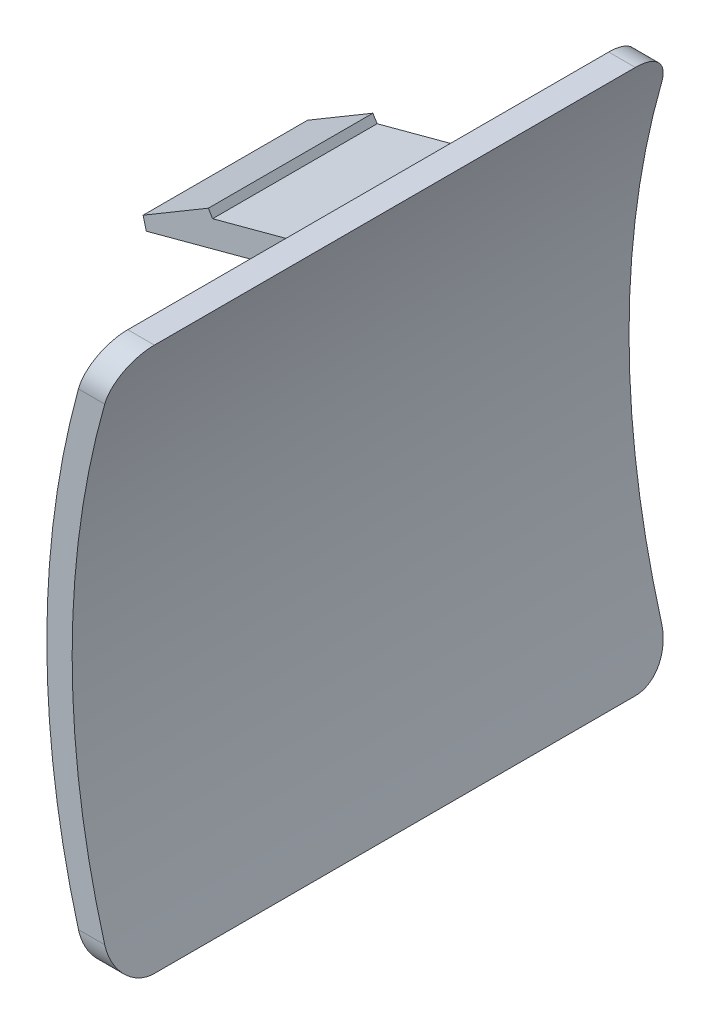
ISO-10303-21;
HEADER;
FILE_DESCRIPTION(('STEP AP214'),'2;1');
FILE_NAME('part.step','',(''),(''),'','','');
FILE_SCHEMA(('AUTOMOTIVE_DESIGN { 1 0 10303 214 1 1 1 1 }'));
ENDSEC;
DATA;
#1=APPLICATION_CONTEXT('core data for automotive mechanical design processes');
#2=APPLICATION_PROTOCOL_DEFINITION('international standard','automotive_design',2000,#1);
#3=PRODUCT_CONTEXT('',#1,'mechanical');
#4=PRODUCT('Part','Part','',(#3));
#5=PRODUCT_RELATED_PRODUCT_CATEGORY('part','',(#4));
#6=PRODUCT_DEFINITION_FORMATION('','',#4);
#7=PRODUCT_DEFINITION_CONTEXT('part definition',#1,'design');
#8=PRODUCT_DEFINITION('design','',#6,#7);
#9=PRODUCT_DEFINITION_SHAPE('','',#8);
#10=(LENGTH_UNIT() NAMED_UNIT(*) SI_UNIT(.MILLI.,.METRE.));
#11=(NAMED_UNIT(*) PLANE_ANGLE_UNIT() SI_UNIT($,.RADIAN.));
#12=(NAMED_UNIT(*) SI_UNIT($,.STERADIAN.) SOLID_ANGLE_UNIT());
#13=UNCERTAINTY_MEASURE_WITH_UNIT(LENGTH_MEASURE(1.E-05),#10,'distance_accuracy_value','');
#14=(GEOMETRIC_REPRESENTATION_CONTEXT(3) GLOBAL_UNCERTAINTY_ASSIGNED_CONTEXT((#13)) GLOBAL_UNIT_ASSIGNED_CONTEXT((#10,
#11,#12)) REPRESENTATION_CONTEXT('',''));
#15=CARTESIAN_POINT('',(0.,0.,0.));
#16=DIRECTION('',(0.,0.,1.));
#17=DIRECTION('',(1.,0.,0.));
#18=AXIS2_PLACEMENT_3D('',#15,#16,#17);
#19=CARTESIAN_POINT('',(64.2857142857143,21.5,22.));
#20=DIRECTION('',(0.,0.,-1.));
#21=DIRECTION('',(-1.,0.,0.));
#22=AXIS2_PLACEMENT_3D('',#19,#20,#21);
#23=CYLINDRICAL_SURFACE('',#22,69.7857142857143);
#24=DIRECTION('',(0.,0.,-1.));
#25=VECTOR('',#24,1.);
#26=CARTESIAN_POINT('',(-2.10551946067234,0.,22.));
#27=LINE('',#26,#25);
#28=CARTESIAN_POINT('',(-2.10551946067234,0.,-14.));
#29=VERTEX_POINT('',#28);
#30=CARTESIAN_POINT('',(-2.10551946067234,0.,-19.));
#31=VERTEX_POINT('',#30);
#32=EDGE_CURVE('E259',#29,#31,#27,.T.);
#33=ORIENTED_EDGE('',*,*,#32,.F.);
#34=CARTESIAN_POINT('',(64.2857142857143,21.5,-14.));
#35=DIRECTION('',(0.,0.,-1.));
#36=DIRECTION('',(-1.,0.,0.));
#37=AXIS2_PLACEMENT_3D('',#34,#35,#36);
#38=CIRCLE('',#37,69.7857142857143);
#39=CARTESIAN_POINT('',(-2.72022514033471,2.,-14.));
#40=VERTEX_POINT('',#39);
#41=EDGE_CURVE('E11',#29,#40,#38,.T.);
#42=ORIENTED_EDGE('',*,*,#41,.T.);
#43=DIRECTION('',(0.,0.,1.));
#44=VECTOR('',#43,1.);
#45=CARTESIAN_POINT('',(-2.72022514033471,2.,-14.));
#46=LINE('',#45,#44);
#47=CARTESIAN_POINT('',(-2.72022514033471,2.,14.));
#48=VERTEX_POINT('',#47);
#49=EDGE_CURVE('E190',#40,#48,#46,.T.);
#50=ORIENTED_EDGE('',*,*,#49,.T.);
#51=CARTESIAN_POINT('',(64.2857142857143,21.5,14.));
#52=DIRECTION('',(0.,0.,-1.));
#53=DIRECTION('',(-1.,0.,0.));
#54=AXIS2_PLACEMENT_3D('',#51,#52,#53);
#55=CIRCLE('',#54,69.7857142857143);
#56=CARTESIAN_POINT('',(-2.10551946067234,0.,14.));
#57=VERTEX_POINT('',#56);
#58=EDGE_CURVE('E44',#57,#48,#55,.T.);
#59=ORIENTED_EDGE('',*,*,#58,.F.);
#60=CARTESIAN_POINT('',(-2.10551946067234,0.,19.));
#61=VERTEX_POINT('',#60);
#62=EDGE_CURVE('E260',#61,#57,#27,.T.);
#63=ORIENTED_EDGE('',*,*,#62,.F.);
#64=CARTESIAN_POINT('',(-2.10551946067234,0.,19.));
#65=CARTESIAN_POINT('',(-2.10551501696998,-1.01738626092935E-05,19.0815368565849));
#66=CARTESIAN_POINT('',(-2.10659585807725,0.00332396672652911,19.1630683755915));
#67=CARTESIAN_POINT('',(-2.11089435800793,0.0166025023390544,19.3255220149787));
#68=CARTESIAN_POINT('',(-2.11411167670767,0.0265458451887064,19.406444230286));
#69=CARTESIAN_POINT('',(-2.12264007168083,0.0529355925499627,19.5669313297271));
#70=CARTESIAN_POINT('',(-2.12794655739604,0.0693677393512529,19.6464987934496));
#71=CARTESIAN_POINT('',(-2.14058315774244,0.108568369515816,19.8038708310787));
#72=CARTESIAN_POINT('',(-2.14791329205247,0.131336914497064,19.8816753878341));
#73=CARTESIAN_POINT('',(-2.17281977344637,0.208871409643781,20.1116204535082));
#74=CARTESIAN_POINT('',(-2.1933206108247,0.272892021442179,20.2604474483555));
#75=CARTESIAN_POINT('',(-2.24118303013875,0.423376822063422,20.544982259512));
#76=CARTESIAN_POINT('',(-2.26854631938181,0.509846596195362,20.6806867994309));
#77=CARTESIAN_POINT('',(-2.32969489649461,0.704716633409515,20.9386511159321));
#78=CARTESIAN_POINT('',(-2.36361009210591,0.813564004478122,21.0605424469952));
#79=CARTESIAN_POINT('',(-2.43613972426656,1.04871062184616,21.2844809986435));
#80=CARTESIAN_POINT('',(-2.47475550262065,1.1750148526931,21.3865225313069));
#81=CARTESIAN_POINT('',(-2.55716621050813,1.44765855496598,21.5726828440337));
#82=CARTESIAN_POINT('',(-2.60111619856115,1.59464483236076,21.6557853755533));
#83=CARTESIAN_POINT('',(-2.69119567624963,1.89987874642333,21.7960572399577));
#84=CARTESIAN_POINT('',(-2.73732490924078,2.05812505813018,21.853229618208));
#85=CARTESIAN_POINT('',(-2.82036128489615,2.34698457738525,21.931025400171));
#86=CARTESIAN_POINT('',(-2.8571294251651,2.47626423877295,21.9568520128862));
#87=CARTESIAN_POINT('',(-2.9304560078544,2.7369784440241,21.9913420708252));
#88=CARTESIAN_POINT('',(-2.96701465025453,2.86841018961436,22.0000262566663));
#89=CARTESIAN_POINT('',(-3.00318463801122,3.,22.));
#90=B_SPLINE_CURVE_WITH_KNOTS('',3,(#64,#65,#66,#67,#68,#69,#70,#71,#72,#73,#74,#75,#76,#77,#78,
#79,#80,#81,#82,#83,#84,#85,#86,#87,#88,#89),.UNSPECIFIED.,.F.,.F.,(4,2,2,2,2,2,2,2,2,2,2,2,4),
(0.,0.244526038440387,0.489013158072891,0.732966034179365,0.976921282675782,1.46436539546978,
1.95193089985118,2.45039768094765,2.94900708702062,3.47011074142947,3.99115317898859,
4.40069276414396,4.80973654302774),.UNSPECIFIED.);
#91=CARTESIAN_POINT('',(-3.00318463801122,3.,22.));
#92=VERTEX_POINT('',#91);
#93=EDGE_CURVE('E325',#61,#92,#90,.T.);
#94=ORIENTED_EDGE('',*,*,#93,.T.);
#95=CARTESIAN_POINT('',(64.2857142857143,21.5,22.));
#96=DIRECTION('',(0.,0.,1.));
#97=DIRECTION('',(-1.,0.,0.));
#98=AXIS2_PLACEMENT_3D('',#95,#96,#97);
#99=CIRCLE('',#98,69.7857142857143);
#100=CARTESIAN_POINT('',(-3.00318463801122,40.,22.));
#101=VERTEX_POINT('',#100);
#102=EDGE_CURVE('E253',#101,#92,#99,.T.);
#103=ORIENTED_EDGE('',*,*,#102,.F.);
#104=CARTESIAN_POINT('',(-3.00318463801122,40.,22.));
#105=CARTESIAN_POINT('',(-2.9791616066791,40.0873811462367,21.9999976685196));
#106=CARTESIAN_POINT('',(-2.95497809575075,40.1746719255745,21.9961801812851));
#107=CARTESIAN_POINT('',(-2.90644696353624,40.3485413986221,21.9809636029016));
#108=CARTESIAN_POINT('',(-2.88209934712524,40.4351201133173,21.9695647360026));
#109=CARTESIAN_POINT('',(-2.80908172916964,40.6928638144405,21.9240926228914));
#110=CARTESIAN_POINT('',(-2.76039870333884,40.8621753836809,21.8787436985147));
#111=CARTESIAN_POINT('',(-2.66463473233409,41.1907610379951,21.7591151242726));
#112=CARTESIAN_POINT('',(-2.61755473038188,41.3500292589464,21.6848187509699));
#113=CARTESIAN_POINT('',(-2.52666227841436,41.6538430615458,21.5090960637745));
#114=CARTESIAN_POINT('',(-2.48284871759094,41.7983936543418,21.407679027031));
#115=CARTESIAN_POINT('',(-2.40071778302798,42.0666031734834,21.181635103034));
#116=CARTESIAN_POINT('',(-2.36233858457695,42.190500534947,21.0573139995549));
#117=CARTESIAN_POINT('',(-2.29208314415359,42.4154664082281,20.7878216958672));
#118=CARTESIAN_POINT('',(-2.26020718269245,42.5165339353217,20.6426495967299));
#119=CARTESIAN_POINT('',(-2.20561603835584,42.688599869808,20.3417480544869));
#120=CARTESIAN_POINT('',(-2.18258752720081,42.7606323465388,20.1866661584203));
#121=CARTESIAN_POINT('',(-2.1451118577037,42.8774429123959,19.8656758159393));
#122=CARTESIAN_POINT('',(-2.13065354132608,42.9222564413407,19.6997817604207));
#123=CARTESIAN_POINT('',(-2.11575847794333,42.9683623263491,19.4435992924132));
#124=CARTESIAN_POINT('',(-2.11192251270819,42.9802200251897,19.3552799946782));
#125=CARTESIAN_POINT('',(-2.10680360106142,42.9960349620433,19.1779894995817));
#126=CARTESIAN_POINT('',(-2.10551706186591,43.0000033181543,19.0890193972179));
#127=CARTESIAN_POINT('',(-2.10551946067235,43.,19.));
#128=B_SPLINE_CURVE_WITH_KNOTS('',3,(#104,#105,#106,#107,#108,#109,#110,#111,#112,#113,#114,
#115,#116,#117,#118,#119,#120,#121,#122,#123,#124,#125,#126,#127),.UNSPECIFIED.,.F.,.F.,(4,2,2,
2,2,2,2,2,2,2,2,4),(0.,0.27170127175353,0.54339450719934,1.0863538582712,1.62962735248521,
2.17271524664818,2.70901846098024,3.24534480337322,3.7603883121472,4.27475977447175,
4.54200051186193,4.80886437110331),.UNSPECIFIED.);
#129=CARTESIAN_POINT('',(-2.10551946067236,43.,19.));
#130=VERTEX_POINT('',#129);
#131=EDGE_CURVE('E342',#101,#130,#128,.T.);
#132=ORIENTED_EDGE('',*,*,#131,.T.);
#133=DIRECTION('',(0.,0.,-1.));
#134=VECTOR('',#133,1.);
#135=CARTESIAN_POINT('',(-2.10551946067236,43.,22.));
#136=LINE('',#135,#134);
#137=CARTESIAN_POINT('',(-2.10551946067236,43.,6.5));
#138=VERTEX_POINT('',#137);
#139=EDGE_CURVE('E263',#130,#138,#136,.T.);
#140=ORIENTED_EDGE('',*,*,#139,.T.);
#141=CARTESIAN_POINT('',(64.2857142857143,21.5,6.5));
#142=DIRECTION('',(0.,0.,1.));
#143=DIRECTION('',(1.,0.,0.));
#144=AXIS2_PLACEMENT_3D('',#141,#142,#143);
#145=CIRCLE('',#144,69.7857142857143);
#146=CARTESIAN_POINT('',(-2.79391106516049,40.7449936646813,6.5));
#147=VERTEX_POINT('',#146);
#148=EDGE_CURVE('E372',#138,#147,#145,.T.);
#149=ORIENTED_EDGE('',*,*,#148,.T.);
#150=DIRECTION('',(0.,0.,1.));
#151=VECTOR('',#150,1.);
#152=CARTESIAN_POINT('',(-2.79391106516066,40.7449936646808,-6.5));
#153=LINE('',#152,#151);
#154=CARTESIAN_POINT('',(-2.79391106516066,40.7449936646808,-6.5));
#155=VERTEX_POINT('',#154);
#156=EDGE_CURVE('E232',#155,#147,#153,.T.);
#157=ORIENTED_EDGE('',*,*,#156,.F.);
#158=CARTESIAN_POINT('',(64.2857142857143,21.5,-6.5));
#159=DIRECTION('',(0.,0.,1.));
#160=DIRECTION('',(1.,0.,0.));
#161=AXIS2_PLACEMENT_3D('',#158,#159,#160);
#162=CIRCLE('',#161,69.7857142857143);
#163=CARTESIAN_POINT('',(-2.10551946067236,43.,-6.5));
#164=VERTEX_POINT('',#163);
#165=EDGE_CURVE('E186',#164,#155,#162,.T.);
#166=ORIENTED_EDGE('',*,*,#165,.F.);
#167=CARTESIAN_POINT('',(-2.10551946067236,43.,-19.));
#168=VERTEX_POINT('',#167);
#169=EDGE_CURVE('E262',#164,#168,#136,.T.);
#170=ORIENTED_EDGE('',*,*,#169,.T.);
#171=CARTESIAN_POINT('',(-2.10551946067236,43.,-19.));
#172=CARTESIAN_POINT('',(-2.10551501697,43.0000101738626,-19.0815368565849));
#173=CARTESIAN_POINT('',(-2.10659585807727,42.9966760332735,-19.1630683755915));
#174=CARTESIAN_POINT('',(-2.11089435800794,42.9833974976609,-19.3255220149787));
#175=CARTESIAN_POINT('',(-2.11411167670767,42.9734541548113,-19.406444230286));
#176=CARTESIAN_POINT('',(-2.12264007168082,42.94706440745,-19.5669313297271));
#177=CARTESIAN_POINT('',(-2.12794655739604,42.9306322606487,-19.6464987934496));
#178=CARTESIAN_POINT('',(-2.14058315774243,42.8914316304842,-19.8038708310787));
#179=CARTESIAN_POINT('',(-2.14791329205246,42.8686630855029,-19.8816753878341));
#180=CARTESIAN_POINT('',(-2.17281977344635,42.7911285903562,-20.1116204535082));
#181=CARTESIAN_POINT('',(-2.19332061082469,42.7271079785578,-20.2604474483555));
#182=CARTESIAN_POINT('',(-2.24118303013876,42.5766231779366,-20.544982259512));
#183=CARTESIAN_POINT('',(-2.26854631938182,42.4901534038046,-20.6806867994309));
#184=CARTESIAN_POINT('',(-2.32969489649462,42.2952833665905,-20.9386511159321));
#185=CARTESIAN_POINT('',(-2.36361009210591,42.1864359955219,-21.0605424469952));
#186=CARTESIAN_POINT('',(-2.43613972426655,41.9512893781538,-21.2844809986435));
#187=CARTESIAN_POINT('',(-2.47475550262064,41.8249851473069,-21.3865225313069));
#188=CARTESIAN_POINT('',(-2.55716621050814,41.552341445034,-21.5726828440337));
#189=CARTESIAN_POINT('',(-2.60111619856116,41.4053551676392,-21.6557853755533));
#190=CARTESIAN_POINT('',(-2.69119567624964,41.1001212535767,-21.7960572399577));
#191=CARTESIAN_POINT('',(-2.73732490924078,40.9418749418698,-21.853229618208));
#192=CARTESIAN_POINT('',(-2.82036128489614,40.6530154226147,-21.931025400171));
#193=CARTESIAN_POINT('',(-2.85712942516509,40.5237357612271,-21.9568520128862));
#194=CARTESIAN_POINT('',(-2.9304560078544,40.2630215559759,-21.9913420708252));
#195=CARTESIAN_POINT('',(-2.96701465025453,40.1315898103856,-22.0000262566663));
#196=CARTESIAN_POINT('',(-3.00318463801122,40.,-22.));
#197=B_SPLINE_CURVE_WITH_KNOTS('',3,(#171,#172,#173,#174,#175,#176,#177,#178,#179,#180,#181,
#182,#183,#184,#185,#186,#187,#188,#189,#190,#191,#192,#193,#194,#195,#196),.UNSPECIFIED.,.F.,
.F.,(4,2,2,2,2,2,2,2,2,2,2,2,4),(0.,0.244526038440383,0.489013158072891,0.732966034179361,
0.976921282675781,1.46436539546978,1.95193089985119,2.45039768094766,2.94900708702063,
3.47011074142947,3.99115317898858,4.40069276414396,4.80973654302774),.UNSPECIFIED.);
#198=CARTESIAN_POINT('',(-3.00318463801122,40.,-22.));
#199=VERTEX_POINT('',#198);
#200=EDGE_CURVE('E326',#168,#199,#197,.T.);
#201=ORIENTED_EDGE('',*,*,#200,.T.);
#202=CARTESIAN_POINT('',(64.2857142857143,21.5,-22.));
#203=DIRECTION('',(0.,0.,1.));
#204=DIRECTION('',(-1.,0.,0.));
#205=AXIS2_PLACEMENT_3D('',#202,#203,#204);
#206=CIRCLE('',#205,69.7857142857143);
#207=CARTESIAN_POINT('',(-3.00318463801122,3.,-22.));
#208=VERTEX_POINT('',#207);
#209=EDGE_CURVE('E247',#199,#208,#206,.T.);
#210=ORIENTED_EDGE('',*,*,#209,.T.);
#211=CARTESIAN_POINT('',(-3.00318463801122,3.,-22.));
#212=CARTESIAN_POINT('',(-2.9791616066791,2.91261885376332,-21.9999976685196));
#213=CARTESIAN_POINT('',(-2.95497809575075,2.82532807442551,-21.9961801812851));
#214=CARTESIAN_POINT('',(-2.90644696353624,2.65145860137794,-21.9809636029016));
#215=CARTESIAN_POINT('',(-2.88209934712524,2.56487988668266,-21.9695647360026));
#216=CARTESIAN_POINT('',(-2.80908172916964,2.30713618555951,-21.9240926228914));
#217=CARTESIAN_POINT('',(-2.76039870333884,2.13782461631908,-21.8787436985147));
#218=CARTESIAN_POINT('',(-2.66463473233409,1.80923896200487,-21.7591151242726));
#219=CARTESIAN_POINT('',(-2.61755473038188,1.64997074105359,-21.6848187509699));
#220=CARTESIAN_POINT('',(-2.52666227841436,1.34615693845423,-21.5090960637745));
#221=CARTESIAN_POINT('',(-2.48284871759094,1.20160634565817,-21.4076790270309));
#222=CARTESIAN_POINT('',(-2.40071778302798,0.933396826516568,-21.181635103034));
#223=CARTESIAN_POINT('',(-2.36233858457695,0.809499465052969,-21.0573139995549));
#224=CARTESIAN_POINT('',(-2.29208314415359,0.584533591771874,-20.7878216958671));
#225=CARTESIAN_POINT('',(-2.26020718269245,0.483466064678291,-20.6426495967299));
#226=CARTESIAN_POINT('',(-2.20561603835583,0.311400130191985,-20.3417480544869));
#227=CARTESIAN_POINT('',(-2.1825875272008,0.239367653461185,-20.1866661584203));
#228=CARTESIAN_POINT('',(-2.14511185770369,0.122557087604105,-19.8656758159393));
#229=CARTESIAN_POINT('',(-2.13065354132608,0.0777435586593168,-19.6997817604207));
#230=CARTESIAN_POINT('',(-2.11575847794333,0.0316376736509253,-19.4435992924132));
#231=CARTESIAN_POINT('',(-2.1119225127082,0.0197799748102861,-19.3552799946782));
#232=CARTESIAN_POINT('',(-2.10680360106142,0.00396503795672688,-19.1779894995817));
#233=CARTESIAN_POINT('',(-2.10551706186592,-3.31815432412348E-06,-19.0890193972179));
#234=CARTESIAN_POINT('',(-2.10551946067235,0.,-19.));
#235=B_SPLINE_CURVE_WITH_KNOTS('',3,(#211,#212,#213,#214,#215,#216,#217,#218,#219,#220,#221,
#222,#223,#224,#225,#226,#227,#228,#229,#230,#231,#232,#233,#234),.UNSPECIFIED.,.F.,.F.,(4,2,2,
2,2,2,2,2,2,2,2,4),(0.,0.271701271753532,0.543394507199339,1.08635385827121,1.62962735248522,
2.17271524664819,2.70901846098025,3.24534480337323,3.76038831214721,4.27475977447175,
4.54200051186194,4.80886437110331),.UNSPECIFIED.);
#236=EDGE_CURVE('E318',#208,#31,#235,.T.);
#237=ORIENTED_EDGE('',*,*,#236,.T.);
#238=EDGE_LOOP('',(#33,#42,#50,#59,#63,#94,#103,#132,#140,#149,#157,#166,#170,#201,#210,#237));
#239=FACE_BOUND('',#238,.T.);
#240=ADVANCED_FACE('F35',(#239),#23,.T.);
#241=CARTESIAN_POINT('',(64.2857142857143,21.5,22.));
#242=DIRECTION('',(0.,0.,-1.));
#243=DIRECTION('',(-1.,0.,0.));
#244=AXIS2_PLACEMENT_3D('',#241,#242,#243);
#245=CYLINDRICAL_SURFACE('',#244,67.7857142857143);
#246=CARTESIAN_POINT('',(64.2857142857143,21.5,22.));
#247=DIRECTION('',(0.,0.,-1.));
#248=DIRECTION('',(-1.,0.,0.));
#249=AXIS2_PLACEMENT_3D('',#246,#247,#248);
#250=CIRCLE('',#249,67.7857142857143);
#251=CARTESIAN_POINT('',(-0.926654642461375,3.,22.));
#252=VERTEX_POINT('',#251);
#253=CARTESIAN_POINT('',(-0.926654642461375,40.,22.));
#254=VERTEX_POINT('',#253);
#255=EDGE_CURVE('E250',#252,#254,#250,.T.);
#256=ORIENTED_EDGE('',*,*,#255,.F.);
#257=CARTESIAN_POINT('',(-0.926654642461375,3.,22.));
#258=CARTESIAN_POINT('',(-0.901811511444257,2.91242444050054,21.9999975467443));
#259=CARTESIAN_POINT('',(-0.876802051141481,2.82494271473947,21.9961631852733));
#260=CARTESIAN_POINT('',(-0.826612584374439,2.6506988989387,21.9808802546029));
#261=CARTESIAN_POINT('',(-0.801432582801923,2.56393678841527,21.9694319028928));
#262=CARTESIAN_POINT('',(-0.725914544903433,2.30564604377073,21.92376217965));
#263=CARTESIAN_POINT('',(-0.675561730308853,2.13598358158715,21.878215983816));
#264=CARTESIAN_POINT('',(-0.5765098289489,1.80673721435202,21.7580595891551));
#265=CARTESIAN_POINT('',(-0.527811725193578,1.64715925340151,21.6834324314699));
#266=CARTESIAN_POINT('',(-0.433797189283386,1.34278645183296,21.5069021593138));
#267=CARTESIAN_POINT('',(-0.388479575266885,1.19798643807926,21.4050086352011));
#268=CARTESIAN_POINT('',(-0.303578637371286,0.929489396540004,21.1779556838055));
#269=CARTESIAN_POINT('',(-0.263926890503194,0.805536653061014,21.0531247107276));
#270=CARTESIAN_POINT('',(-0.191369127032178,0.580564385796293,20.7824895001585));
#271=CARTESIAN_POINT('',(-0.158463313486562,0.479545552327456,20.6366846315629));
#272=CARTESIAN_POINT('',(-0.102238049050867,0.307961584357731,20.3348422779093));
#273=CARTESIAN_POINT('',(-0.0785721874464789,0.236289700792838,20.179497808749));
#274=CARTESIAN_POINT('',(-0.0401212656114709,0.120249627220845,19.8579888450833));
#275=CARTESIAN_POINT('',(-0.0253242331867742,0.0758446271567862,19.6918392741831));
#276=CARTESIAN_POINT('',(-0.0102488174974433,0.0306632204692212,19.4367492094739));
#277=CARTESIAN_POINT('',(-0.00640909652114741,0.0191706019554938,19.3497823603511));
#278=CARTESIAN_POINT('',(-0.00128538873527843,0.00384300502288027,19.1752259117716));
#279=CARTESIAN_POINT('',(2.19778350067652E-06,-2.75907939609466E-06,19.0876373645733));
#280=CARTESIAN_POINT('',(0.,0.,19.));
#281=B_SPLINE_CURVE_WITH_KNOTS('',3,(#257,#258,#259,#260,#261,#262,#263,#264,#265,#266,#267,
#268,#269,#270,#271,#272,#273,#274,#275,#276,#277,#278,#279,#280),.UNSPECIFIED.,.F.,.F.,(4,2,2,
2,2,2,2,2,2,2,2,4),(0.,0.27292396447767,0.545840133371109,1.09127397132985,1.6370263617186,
2.18258704717552,2.72087090769652,3.25917096855972,3.77471789887981,4.2895673063214,
4.55266119823392,4.81538373927645),.UNSPECIFIED.);
#282=CARTESIAN_POINT('',(0.,0.,19.));
#283=VERTEX_POINT('',#282);
#284=EDGE_CURVE('E305',#252,#283,#281,.T.);
#285=ORIENTED_EDGE('',*,*,#284,.T.);
#286=DIRECTION('',(0.,0.,-1.));
#287=VECTOR('',#286,1.);
#288=CARTESIAN_POINT('',(0.,0.,22.));
#289=LINE('',#288,#287);
#290=CARTESIAN_POINT('',(0.,0.,-19.));
#291=VERTEX_POINT('',#290);
#292=EDGE_CURVE('E256',#283,#291,#289,.T.);
#293=ORIENTED_EDGE('',*,*,#292,.T.);
#294=CARTESIAN_POINT('',(0.,0.,-19.));
#295=CARTESIAN_POINT('',(4.62604724322607E-06,-1.02928488541194E-05,-19.0813632677312));
#296=CARTESIAN_POINT('',(-0.00110692106085537,0.00330982023830322,-19.1627211036077));
#297=CARTESIAN_POINT('',(-0.00552722299784744,0.0165315802131698,-19.3248269757503));
#298=CARTESIAN_POINT('',(-0.00883561268904752,0.0264321333647355,-19.4055751110995));
#299=CARTESIAN_POINT('',(-0.0176045192111121,0.0527056909258864,-19.5657081251298));
#300=CARTESIAN_POINT('',(-0.0230601338602828,0.0690639524401327,-19.6450956822269));
#301=CARTESIAN_POINT('',(-0.0360506896023055,0.108084906128816,-19.8021101030537));
#302=CARTESIAN_POINT('',(-0.0435856538227979,0.130747668425312,-19.8797369471894));
#303=CARTESIAN_POINT('',(-0.0691849336886414,0.207912625729289,-20.1091494136417));
#304=CARTESIAN_POINT('',(-0.090252600458457,0.271618114025225,-20.257627289435));
#305=CARTESIAN_POINT('',(-0.139426863856904,0.421327939385621,-20.5415115847858));
#306=CARTESIAN_POINT('',(-0.167535389972309,0.507338389160781,-20.6769144071222));
#307=CARTESIAN_POINT('',(-0.230377047491299,0.701259037659878,-20.9345222629233));
#308=CARTESIAN_POINT('',(-0.26525125643447,0.809639486748916,-21.0563389632274));
#309=CARTESIAN_POINT('',(-0.33982482877125,1.04375810679727,-21.2802136415988));
#310=CARTESIAN_POINT('',(-0.379525586774179,1.16950129607301,-21.3822658866245));
#311=CARTESIAN_POINT('',(-0.464364850336401,1.44129851401442,-21.5688331150828));
#312=CARTESIAN_POINT('',(-0.509672752625215,1.58803701869847,-21.6522736057698));
#313=CARTESIAN_POINT('',(-0.602543406120969,1.89279630931427,-21.7932566053006));
#314=CARTESIAN_POINT('',(-0.650105956115611,2.05081608910185,-21.8508014203695));
#315=CARTESIAN_POINT('',(-0.736126633757342,2.34063855502117,-21.9296627764422));
#316=CARTESIAN_POINT('',(-0.774443833080369,2.47114337102277,-21.9559980690327));
#317=CARTESIAN_POINT('',(-0.850862005245678,2.7343782857769,-21.9911696681183));
#318=CARTESIAN_POINT('',(-0.888963182271369,2.8671055285422,-22.0000269198197));
#319=CARTESIAN_POINT('',(-0.926654642461377,3.,-22.));
#320=B_SPLINE_CURVE_WITH_KNOTS('',3,(#294,#295,#296,#297,#298,#299,#300,#301,#302,#303,#304,
#305,#306,#307,#308,#309,#310,#311,#312,#313,#314,#315,#316,#317,#318,#319),.UNSPECIFIED.,.F.,
.F.,(4,2,2,2,2,2,2,2,2,2,2,2,4),(0.,0.244005125718436,0.487969705438914,0.731380507483232,
0.974794016982071,1.46113890899101,1.94761722571304,2.44561245676281,2.94375192479113,
3.4657578943608,3.98771736575485,4.40224903951159,4.8162836474348),.UNSPECIFIED.);
#321=CARTESIAN_POINT('',(-0.926654642461375,3.,-22.));
#322=VERTEX_POINT('',#321);
#323=EDGE_CURVE('E301',#291,#322,#320,.T.);
#324=ORIENTED_EDGE('',*,*,#323,.T.);
#325=CARTESIAN_POINT('',(64.2857142857143,21.5,-22.));
#326=DIRECTION('',(0.,0.,-1.));
#327=DIRECTION('',(-1.,0.,0.));
#328=AXIS2_PLACEMENT_3D('',#325,#326,#327);
#329=CIRCLE('',#328,67.7857142857143);
#330=CARTESIAN_POINT('',(-0.926654642461375,40.,-22.));
#331=VERTEX_POINT('',#330);
#332=EDGE_CURVE('E234',#322,#331,#329,.T.);
#333=ORIENTED_EDGE('',*,*,#332,.T.);
#334=CARTESIAN_POINT('',(-0.926654642461375,40.,-22.));
#335=CARTESIAN_POINT('',(-0.901811511444259,40.0875755594994,-21.9999975467443));
#336=CARTESIAN_POINT('',(-0.876802051141484,40.1750572852605,-21.9961631852733));
#337=CARTESIAN_POINT('',(-0.826612584374442,40.3493011010613,-21.9808802546029));
#338=CARTESIAN_POINT('',(-0.801432582801925,40.4360632115847,-21.9694319028928));
#339=CARTESIAN_POINT('',(-0.725914544903433,40.6943539562293,-21.92376217965));
#340=CARTESIAN_POINT('',(-0.675561730308851,40.8640164184128,-21.878215983816));
#341=CARTESIAN_POINT('',(-0.576509828948902,41.193262785648,-21.7580595891551));
#342=CARTESIAN_POINT('',(-0.527811725193589,41.3528407465985,-21.6834324314699));
#343=CARTESIAN_POINT('',(-0.433797189283398,41.657213548167,-21.5069021593138));
#344=CARTESIAN_POINT('',(-0.388479575266891,41.8020135619207,-21.4050086352011));
#345=CARTESIAN_POINT('',(-0.303578637371281,42.07051060346,-21.1779556838055));
#346=CARTESIAN_POINT('',(-0.263926890503182,42.194463346939,-21.0531247107276));
#347=CARTESIAN_POINT('',(-0.191369127032177,42.4194356142037,-20.7824895001584));
#348=CARTESIAN_POINT('',(-0.158463313486577,42.5204544476725,-20.6366846315629));
#349=CARTESIAN_POINT('',(-0.102238049050882,42.6920384156423,-20.3348422779093));
#350=CARTESIAN_POINT('',(-0.0785721874464801,42.7637102992072,-20.1794978087489));
#351=CARTESIAN_POINT('',(-0.0401212656114746,42.8797503727791,-19.8579888450833));
#352=CARTESIAN_POINT('',(-0.0253242331867947,42.9241553728432,-19.6918392741831));
#353=CARTESIAN_POINT('',(-0.0102488174974602,42.9693367795308,-19.4367492094739));
#354=CARTESIAN_POINT('',(-0.00640909652115798,42.9808293980445,-19.3497823603511));
#355=CARTESIAN_POINT('',(-0.00128538873528355,42.9961569949771,-19.1752259117716));
#356=CARTESIAN_POINT('',(2.19778349460998E-06,43.0000027590794,-19.0876373645733));
#357=CARTESIAN_POINT('',(0.,43.,-19.));
#358=B_SPLINE_CURVE_WITH_KNOTS('',3,(#334,#335,#336,#337,#338,#339,#340,#341,#342,#343,#344,
#345,#346,#347,#348,#349,#350,#351,#352,#353,#354,#355,#356,#357),.UNSPECIFIED.,.F.,.F.,(4,2,2,
2,2,2,2,2,2,2,2,4),(0.,0.272923964477667,0.545840133371108,1.09127397132985,1.6370263617186,
2.18258704717553,2.72087090769652,3.25917096855972,3.77471789887982,4.28956730632141,
4.55266119823392,4.81538373927645),.UNSPECIFIED.);
#359=CARTESIAN_POINT('',(0.,43.,-19.));
#360=VERTEX_POINT('',#359);
#361=EDGE_CURVE('E281',#331,#360,#358,.T.);
#362=ORIENTED_EDGE('',*,*,#361,.T.);
#363=DIRECTION('',(0.,0.,-1.));
#364=VECTOR('',#363,1.);
#365=CARTESIAN_POINT('',(0.,43.,22.));
#366=LINE('',#365,#364);
#367=CARTESIAN_POINT('',(0.,43.,19.));
#368=VERTEX_POINT('',#367);
#369=EDGE_CURVE('E266',#368,#360,#366,.T.);
#370=ORIENTED_EDGE('',*,*,#369,.F.);
#371=CARTESIAN_POINT('',(0.,43.,19.));
#372=CARTESIAN_POINT('',(4.62604725130821E-06,43.0000102928488,19.0813632677313));
#373=CARTESIAN_POINT('',(-0.00110692106084925,42.9966901797617,19.1627211036077));
#374=CARTESIAN_POINT('',(-0.00552722299784779,42.9834684197868,19.3248269757503));
#375=CARTESIAN_POINT('',(-0.00883561268905242,42.9735678666353,19.4055751110995));
#376=CARTESIAN_POINT('',(-0.0176045192111115,42.9472943090741,19.5657081251298));
#377=CARTESIAN_POINT('',(-0.0230601338602722,42.9309360475599,19.6450956822269));
#378=CARTESIAN_POINT('',(-0.0360506896022986,42.8919150938712,19.8021101030537));
#379=CARTESIAN_POINT('',(-0.0435856538228045,42.8692523315747,19.8797369471894));
#380=CARTESIAN_POINT('',(-0.0691849336886732,42.7920873742707,20.1091494136417));
#381=CARTESIAN_POINT('',(-0.0902526004584852,42.7283818859748,20.257627289435));
#382=CARTESIAN_POINT('',(-0.139426863856917,42.5786720606144,20.5415115847858));
#383=CARTESIAN_POINT('',(-0.16753538997231,42.4926616108392,20.6769144071222));
#384=CARTESIAN_POINT('',(-0.230377047491298,42.2987409623401,20.9345222629233));
#385=CARTESIAN_POINT('',(-0.265251256434479,42.1903605132511,21.0563389632274));
#386=CARTESIAN_POINT('',(-0.339824828771262,41.9562418932027,21.2802136415988));
#387=CARTESIAN_POINT('',(-0.379525586774182,41.830498703927,21.3822658866245));
#388=CARTESIAN_POINT('',(-0.464364850336399,41.5587014859856,21.5688331150828));
#389=CARTESIAN_POINT('',(-0.509672752625216,41.4119629813015,21.6522736057698));
#390=CARTESIAN_POINT('',(-0.602543406120972,41.1072036906857,21.7932566053006));
#391=CARTESIAN_POINT('',(-0.650105956115613,40.9491839108982,21.8508014203695));
#392=CARTESIAN_POINT('',(-0.736126633757343,40.6593614449788,21.9296627764422));
#393=CARTESIAN_POINT('',(-0.774443833080371,40.5288566289772,21.9559980690327));
#394=CARTESIAN_POINT('',(-0.85086200524568,40.2656217142231,21.9911696681183));
#395=CARTESIAN_POINT('',(-0.888963182271373,40.1328944714578,22.0000269198197));
#396=CARTESIAN_POINT('',(-0.92665464246138,40.,22.));
#397=B_SPLINE_CURVE_WITH_KNOTS('',3,(#371,#372,#373,#374,#375,#376,#377,#378,#379,#380,#381,
#382,#383,#384,#385,#386,#387,#388,#389,#390,#391,#392,#393,#394,#395,#396),.UNSPECIFIED.,.F.,
.F.,(4,2,2,2,2,2,2,2,2,2,2,2,4),(0.,0.244005125718436,0.487969705438918,0.731380507483241,
0.974794016982073,1.46113890899102,1.94761722571304,2.44561245676281,2.94375192479113,
3.46575789436079,3.98771736575485,4.40224903951159,4.8162836474348),.UNSPECIFIED.);
#398=EDGE_CURVE('E275',#368,#254,#397,.T.);
#399=ORIENTED_EDGE('',*,*,#398,.T.);
#400=EDGE_LOOP('',(#256,#285,#293,#324,#333,#362,#370,#399));
#401=FACE_BOUND('',#400,.T.);
#402=ADVANCED_FACE('F286',(#401),#245,.F.);
#403=CARTESIAN_POINT('',(0.,43.,22.));
#404=DIRECTION('',(0.,-1.,0.));
#405=DIRECTION('',(0.,0.,-1.));
#406=AXIS2_PLACEMENT_3D('',#403,#404,#405);
#407=PLANE('',#406);
#408=ORIENTED_EDGE('',*,*,#369,.T.);
#409=DIRECTION('',(-1.,0.,0.));
#410=VECTOR('',#409,1.);
#411=CARTESIAN_POINT('',(-2.10551946067236,43.,-19.));
#412=LINE('',#411,#410);
#413=EDGE_CURVE('E369',#360,#168,#412,.T.);
#414=ORIENTED_EDGE('',*,*,#413,.T.);
#415=ORIENTED_EDGE('',*,*,#169,.F.);
#416=DIRECTION('',(0.,0.,1.));
#417=VECTOR('',#416,1.);
#418=CARTESIAN_POINT('',(-2.10551946067236,43.,-6.5));
#419=LINE('',#418,#417);
#420=EDGE_CURVE('E231',#164,#138,#419,.T.);
#421=ORIENTED_EDGE('',*,*,#420,.T.);
#422=ORIENTED_EDGE('',*,*,#139,.F.);
#423=DIRECTION('',(-1.,0.,0.));
#424=VECTOR('',#423,1.);
#425=CARTESIAN_POINT('',(0.,43.,19.));
#426=LINE('',#425,#424);
#427=EDGE_CURVE('E365',#130,#368,#426,.F.);
#428=ORIENTED_EDGE('',*,*,#427,.T.);
#429=EDGE_LOOP('',(#408,#414,#415,#421,#422,#428));
#430=FACE_BOUND('',#429,.T.);
#431=ADVANCED_FACE('F291',(#430),#407,.F.);
#432=CARTESIAN_POINT('',(0.,0.,22.));
#433=DIRECTION('',(0.,1.,0.));
#434=DIRECTION('',(0.,0.,1.));
#435=AXIS2_PLACEMENT_3D('',#432,#433,#434);
#436=PLANE('',#435);
#437=ORIENTED_EDGE('',*,*,#292,.F.);
#438=DIRECTION('',(1.,0.,0.));
#439=VECTOR('',#438,1.);
#440=CARTESIAN_POINT('',(0.,0.,19.));
#441=LINE('',#440,#439);
#442=EDGE_CURVE('E348',#283,#61,#441,.F.);
#443=ORIENTED_EDGE('',*,*,#442,.T.);
#444=ORIENTED_EDGE('',*,*,#62,.T.);
#445=DIRECTION('',(1.,0.,0.));
#446=VECTOR('',#445,1.);
#447=CARTESIAN_POINT('',(-2.10551946067234,0.,14.));
#448=LINE('',#447,#446);
#449=CARTESIAN_POINT('',(-8.,0.,14.));
#450=VERTEX_POINT('',#449);
#451=EDGE_CURVE('E181',#450,#57,#448,.T.);
#452=ORIENTED_EDGE('',*,*,#451,.F.);
#453=DIRECTION('',(0.,0.,1.));
#454=VECTOR('',#453,1.);
#455=CARTESIAN_POINT('',(-8.,0.,-14.));
#456=LINE('',#455,#454);
#457=CARTESIAN_POINT('',(-8.,0.,-14.));
#458=VERTEX_POINT('',#457);
#459=EDGE_CURVE('E207',#458,#450,#456,.T.);
#460=ORIENTED_EDGE('',*,*,#459,.F.);
#461=DIRECTION('',(1.,0.,0.));
#462=VECTOR('',#461,1.);
#463=CARTESIAN_POINT('',(-2.10551946067234,0.,-14.));
#464=LINE('',#463,#462);
#465=EDGE_CURVE('E51',#458,#29,#464,.T.);
#466=ORIENTED_EDGE('',*,*,#465,.T.);
#467=ORIENTED_EDGE('',*,*,#32,.T.);
#468=DIRECTION('',(1.,0.,0.));
#469=VECTOR('',#468,1.);
#470=CARTESIAN_POINT('',(0.,0.,-19.));
#471=LINE('',#470,#469);
#472=EDGE_CURVE('E349',#31,#291,#471,.T.);
#473=ORIENTED_EDGE('',*,*,#472,.T.);
#474=EDGE_LOOP('',(#437,#443,#444,#452,#460,#466,#467,#473));
#475=FACE_BOUND('',#474,.T.);
#476=ADVANCED_FACE('F338',(#475),#436,.F.);
#477=CARTESIAN_POINT('',(64.2857142857143,21.5,22.));
#478=DIRECTION('',(0.,0.,-1.));
#479=DIRECTION('',(-1.,0.,0.));
#480=AXIS2_PLACEMENT_3D('',#477,#478,#479);
#481=PLANE('',#480);
#482=ORIENTED_EDGE('',*,*,#102,.T.);
#483=DIRECTION('',(1.,0.,0.));
#484=VECTOR('',#483,1.);
#485=CARTESIAN_POINT('',(64.2857142857143,3.,22.));
#486=LINE('',#485,#484);
#487=EDGE_CURVE('E272',#92,#252,#486,.T.);
#488=ORIENTED_EDGE('',*,*,#487,.T.);
#489=ORIENTED_EDGE('',*,*,#255,.T.);
#490=DIRECTION('',(-1.,0.,0.));
#491=VECTOR('',#490,1.);
#492=CARTESIAN_POINT('',(64.2857142857143,40.,22.));
#493=LINE('',#492,#491);
#494=EDGE_CURVE('E269',#254,#101,#493,.T.);
#495=ORIENTED_EDGE('',*,*,#494,.T.);
#496=EDGE_LOOP('',(#482,#488,#489,#495));
#497=FACE_BOUND('',#496,.T.);
#498=ADVANCED_FACE('F403',(#497),#481,.F.);
#499=CARTESIAN_POINT('',(64.2857142857143,21.5,-22.));
#500=DIRECTION('',(0.,0.,-1.));
#501=DIRECTION('',(-1.,0.,0.));
#502=AXIS2_PLACEMENT_3D('',#499,#500,#501);
#503=PLANE('',#502);
#504=ORIENTED_EDGE('',*,*,#332,.F.);
#505=DIRECTION('',(1.,0.,0.));
#506=VECTOR('',#505,1.);
#507=CARTESIAN_POINT('',(-2.10551946067234,3.,-22.));
#508=LINE('',#507,#506);
#509=EDGE_CURVE('E360',#322,#208,#508,.F.);
#510=ORIENTED_EDGE('',*,*,#509,.T.);
#511=ORIENTED_EDGE('',*,*,#209,.F.);
#512=DIRECTION('',(-1.,0.,0.));
#513=VECTOR('',#512,1.);
#514=CARTESIAN_POINT('',(0.,40.,-22.));
#515=LINE('',#514,#513);
#516=EDGE_CURVE('E359',#199,#331,#515,.F.);
#517=ORIENTED_EDGE('',*,*,#516,.T.);
#518=EDGE_LOOP('',(#504,#510,#511,#517));
#519=FACE_BOUND('',#518,.T.);
#520=ADVANCED_FACE('F405',(#519),#503,.T.);
#521=CARTESIAN_POINT('',(64.2857142857143,3.,19.));
#522=DIRECTION('',(1.,0.,0.));
#523=DIRECTION('',(0.,0.,-1.));
#524=AXIS2_PLACEMENT_3D('',#521,#522,#523);
#525=CYLINDRICAL_SURFACE('',#524,3.);
#526=ORIENTED_EDGE('',*,*,#93,.F.);
#527=ORIENTED_EDGE('',*,*,#442,.F.);
#528=ORIENTED_EDGE('',*,*,#284,.F.);
#529=ORIENTED_EDGE('',*,*,#487,.F.);
#530=EDGE_LOOP('',(#526,#527,#528,#529));
#531=FACE_BOUND('',#530,.T.);
#532=ADVANCED_FACE('F294',(#531),#525,.T.);
#533=CARTESIAN_POINT('',(0.,3.,-19.));
#534=DIRECTION('',(-1.,0.,0.));
#535=DIRECTION('',(0.,0.,1.));
#536=AXIS2_PLACEMENT_3D('',#533,#534,#535);
#537=CYLINDRICAL_SURFACE('',#536,3.);
#538=ORIENTED_EDGE('',*,*,#236,.F.);
#539=ORIENTED_EDGE('',*,*,#509,.F.);
#540=ORIENTED_EDGE('',*,*,#323,.F.);
#541=ORIENTED_EDGE('',*,*,#472,.F.);
#542=EDGE_LOOP('',(#538,#539,#540,#541));
#543=FACE_BOUND('',#542,.T.);
#544=ADVANCED_FACE('F310',(#543),#537,.T.);
#545=CARTESIAN_POINT('',(0.,40.,-19.));
#546=DIRECTION('',(1.,0.,0.));
#547=DIRECTION('',(0.,0.,-1.));
#548=AXIS2_PLACEMENT_3D('',#545,#546,#547);
#549=CYLINDRICAL_SURFACE('',#548,3.);
#550=ORIENTED_EDGE('',*,*,#361,.F.);
#551=ORIENTED_EDGE('',*,*,#516,.F.);
#552=ORIENTED_EDGE('',*,*,#200,.F.);
#553=ORIENTED_EDGE('',*,*,#413,.F.);
#554=EDGE_LOOP('',(#550,#551,#552,#553));
#555=FACE_BOUND('',#554,.T.);
#556=ADVANCED_FACE('F313',(#555),#549,.T.);
#557=CARTESIAN_POINT('',(64.2857142857143,40.,19.));
#558=DIRECTION('',(-1.,0.,0.));
#559=DIRECTION('',(0.,0.,1.));
#560=AXIS2_PLACEMENT_3D('',#557,#558,#559);
#561=CYLINDRICAL_SURFACE('',#560,3.);
#562=ORIENTED_EDGE('',*,*,#398,.F.);
#563=ORIENTED_EDGE('',*,*,#427,.F.);
#564=ORIENTED_EDGE('',*,*,#131,.F.);
#565=ORIENTED_EDGE('',*,*,#494,.F.);
#566=EDGE_LOOP('',(#562,#563,#564,#565));
#567=FACE_BOUND('',#566,.T.);
#568=ADVANCED_FACE('F37',(#567),#561,.T.);
#569=CARTESIAN_POINT('',(0.,0.,-6.5));
#570=DIRECTION('',(0.,0.,1.));
#571=DIRECTION('',(1.,0.,0.));
#572=AXIS2_PLACEMENT_3D('',#569,#570,#571);
#573=PLANE('',#572);
#574=DIRECTION('',(-0.965925826289068,-0.25881904510252,0.));
#575=VECTOR('',#574,1.);
#576=CARTESIAN_POINT('',(-2.10551946067236,43.,-6.5));
#577=LINE('',#576,#575);
#578=CARTESIAN_POINT('',(-7.90107441840677,41.4470857293849,-6.5));
#579=VERTEX_POINT('',#578);
#580=EDGE_CURVE('E216',#164,#579,#577,.T.);
#581=ORIENTED_EDGE('',*,*,#580,.F.);
#582=ORIENTED_EDGE('',*,*,#165,.T.);
#583=DIRECTION('',(0.965925826289068,0.258819045102522,0.));
#584=VECTOR('',#583,1.);
#585=CARTESIAN_POINT('',(-13.1386742597277,37.9731227208054,-6.5));
#586=LINE('',#585,#584);
#587=CARTESIAN_POINT('',(-13.1386742597277,37.9731227208054,-6.5));
#588=VERTEX_POINT('',#587);
#589=EDGE_CURVE('E228',#588,#155,#586,.T.);
#590=ORIENTED_EDGE('',*,*,#589,.F.);
#591=DIRECTION('',(0.25881904510252,-0.965925826289068,0.));
#592=VECTOR('',#591,1.);
#593=CARTESIAN_POINT('',(-13.3974933048302,38.9390485470944,-6.5));
#594=LINE('',#593,#592);
#595=CARTESIAN_POINT('',(-13.3974933048302,38.9390485470944,-6.5));
#596=VERTEX_POINT('',#595);
#597=EDGE_CURVE('E225',#596,#588,#594,.T.);
#598=ORIENTED_EDGE('',*,*,#597,.F.);
#599=DIRECTION('',(-0.860080361280197,-0.510158575484256,0.));
#600=VECTOR('',#599,1.);
#601=CARTESIAN_POINT('',(-8.23701113714901,42.,-6.5));
#602=LINE('',#601,#600);
#603=CARTESIAN_POINT('',(-8.23701113714901,42.,-6.5));
#604=VERTEX_POINT('',#603);
#605=EDGE_CURVE('E222',#604,#596,#602,.T.);
#606=ORIENTED_EDGE('',*,*,#605,.F.);
#607=DIRECTION('',(-0.519247764948314,0.854623752651528,0.));
#608=VECTOR('',#607,1.);
#609=CARTESIAN_POINT('',(-7.90107441840677,41.4470857293849,-6.5));
#610=LINE('',#609,#608);
#611=EDGE_CURVE('E219',#579,#604,#610,.T.);
#612=ORIENTED_EDGE('',*,*,#611,.F.);
#613=EDGE_LOOP('',(#581,#582,#590,#598,#606,#612));
#614=FACE_BOUND('',#613,.T.);
#615=ADVANCED_FACE('F379',(#614),#573,.F.);
#616=CARTESIAN_POINT('',(0.,0.,6.5));
#617=DIRECTION('',(0.,0.,1.));
#618=DIRECTION('',(1.,0.,0.));
#619=AXIS2_PLACEMENT_3D('',#616,#617,#618);
#620=PLANE('',#619);
#621=ORIENTED_EDGE('',*,*,#148,.F.);
#622=DIRECTION('',(-0.965925826289068,-0.25881904510252,0.));
#623=VECTOR('',#622,1.);
#624=CARTESIAN_POINT('',(-2.10551946067236,43.,6.5));
#625=LINE('',#624,#623);
#626=CARTESIAN_POINT('',(-7.90107441840677,41.4470857293849,6.5));
#627=VERTEX_POINT('',#626);
#628=EDGE_CURVE('E203',#138,#627,#625,.T.);
#629=ORIENTED_EDGE('',*,*,#628,.T.);
#630=DIRECTION('',(-0.519247764948314,0.854623752651528,0.));
#631=VECTOR('',#630,1.);
#632=CARTESIAN_POINT('',(-7.90107441840677,41.4470857293849,6.5));
#633=LINE('',#632,#631);
#634=CARTESIAN_POINT('',(-8.23701113714901,42.,6.5));
#635=VERTEX_POINT('',#634);
#636=EDGE_CURVE('E206',#627,#635,#633,.T.);
#637=ORIENTED_EDGE('',*,*,#636,.T.);
#638=DIRECTION('',(-0.860080361280197,-0.510158575484256,0.));
#639=VECTOR('',#638,1.);
#640=CARTESIAN_POINT('',(-8.23701113714901,42.,6.5));
#641=LINE('',#640,#639);
#642=CARTESIAN_POINT('',(-13.3974933048302,38.9390485470944,6.5));
#643=VERTEX_POINT('',#642);
#644=EDGE_CURVE('E210',#635,#643,#641,.T.);
#645=ORIENTED_EDGE('',*,*,#644,.T.);
#646=DIRECTION('',(0.25881904510252,-0.965925826289068,0.));
#647=VECTOR('',#646,1.);
#648=CARTESIAN_POINT('',(-13.3974933048302,38.9390485470944,6.5));
#649=LINE('',#648,#647);
#650=CARTESIAN_POINT('',(-13.1386742597277,37.9731227208054,6.5));
#651=VERTEX_POINT('',#650);
#652=EDGE_CURVE('E213',#643,#651,#649,.T.);
#653=ORIENTED_EDGE('',*,*,#652,.T.);
#654=DIRECTION('',(0.965925826289068,0.258819045102522,0.));
#655=VECTOR('',#654,1.);
#656=CARTESIAN_POINT('',(-13.1386742597277,37.9731227208054,6.5));
#657=LINE('',#656,#655);
#658=EDGE_CURVE('E59',#651,#147,#657,.T.);
#659=ORIENTED_EDGE('',*,*,#658,.T.);
#660=EDGE_LOOP('',(#621,#629,#637,#645,#653,#659));
#661=FACE_BOUND('',#660,.T.);
#662=ADVANCED_FACE('F388',(#661),#620,.T.);
#663=CARTESIAN_POINT('',(-13.1386742597277,37.9731227208054,-6.5));
#664=DIRECTION('',(0.258819045102522,-0.965925826289068,0.));
#665=DIRECTION('',(0.965925826289068,0.258819045102522,0.));
#666=AXIS2_PLACEMENT_3D('',#663,#664,#665);
#667=PLANE('',#666);
#668=ORIENTED_EDGE('',*,*,#156,.T.);
#669=ORIENTED_EDGE('',*,*,#658,.F.);
#670=DIRECTION('',(0.,0.,1.));
#671=VECTOR('',#670,1.);
#672=CARTESIAN_POINT('',(-13.1386742597277,37.9731227208054,-6.5));
#673=LINE('',#672,#671);
#674=EDGE_CURVE('E235',#588,#651,#673,.T.);
#675=ORIENTED_EDGE('',*,*,#674,.F.);
#676=ORIENTED_EDGE('',*,*,#589,.T.);
#677=EDGE_LOOP('',(#668,#669,#675,#676));
#678=FACE_BOUND('',#677,.T.);
#679=ADVANCED_FACE('F385',(#678),#667,.T.);
#680=CARTESIAN_POINT('',(-13.3974933048302,38.9390485470944,-6.5));
#681=DIRECTION('',(-0.965925826289068,-0.25881904510252,0.));
#682=DIRECTION('',(0.25881904510252,-0.965925826289068,0.));
#683=AXIS2_PLACEMENT_3D('',#680,#681,#682);
#684=PLANE('',#683);
#685=ORIENTED_EDGE('',*,*,#674,.T.);
#686=ORIENTED_EDGE('',*,*,#652,.F.);
#687=DIRECTION('',(0.,0.,1.));
#688=VECTOR('',#687,1.);
#689=CARTESIAN_POINT('',(-13.3974933048302,38.9390485470944,-6.5));
#690=LINE('',#689,#688);
#691=EDGE_CURVE('E237',#596,#643,#690,.T.);
#692=ORIENTED_EDGE('',*,*,#691,.F.);
#693=ORIENTED_EDGE('',*,*,#597,.T.);
#694=EDGE_LOOP('',(#685,#686,#692,#693));
#695=FACE_BOUND('',#694,.T.);
#696=ADVANCED_FACE('F422',(#695),#684,.T.);
#697=CARTESIAN_POINT('',(-8.23701113714901,42.,-6.5));
#698=DIRECTION('',(-0.510158575484257,0.860080361280197,0.));
#699=DIRECTION('',(-0.860080361280197,-0.510158575484257,0.));
#700=AXIS2_PLACEMENT_3D('',#697,#698,#699);
#701=PLANE('',#700);
#702=ORIENTED_EDGE('',*,*,#691,.T.);
#703=ORIENTED_EDGE('',*,*,#644,.F.);
#704=DIRECTION('',(0.,0.,1.));
#705=VECTOR('',#704,1.);
#706=CARTESIAN_POINT('',(-8.23701113714901,42.,-6.5));
#707=LINE('',#706,#705);
#708=EDGE_CURVE('E239',#604,#635,#707,.T.);
#709=ORIENTED_EDGE('',*,*,#708,.F.);
#710=ORIENTED_EDGE('',*,*,#605,.T.);
#711=EDGE_LOOP('',(#702,#703,#709,#710));
#712=FACE_BOUND('',#711,.T.);
#713=ADVANCED_FACE('F418',(#712),#701,.T.);
#714=CARTESIAN_POINT('',(-7.90107441840677,41.4470857293849,-6.5));
#715=DIRECTION('',(0.854623752651528,0.519247764948314,0.));
#716=DIRECTION('',(-0.519247764948314,0.854623752651528,0.));
#717=AXIS2_PLACEMENT_3D('',#714,#715,#716);
#718=PLANE('',#717);
#719=ORIENTED_EDGE('',*,*,#708,.T.);
#720=ORIENTED_EDGE('',*,*,#636,.F.);
#721=DIRECTION('',(0.,0.,1.));
#722=VECTOR('',#721,1.);
#723=CARTESIAN_POINT('',(-7.90107441840677,41.4470857293849,-6.5));
#724=LINE('',#723,#722);
#725=EDGE_CURVE('E241',#579,#627,#724,.T.);
#726=ORIENTED_EDGE('',*,*,#725,.F.);
#727=ORIENTED_EDGE('',*,*,#611,.T.);
#728=EDGE_LOOP('',(#719,#720,#726,#727));
#729=FACE_BOUND('',#728,.T.);
#730=ADVANCED_FACE('F415',(#729),#718,.T.);
#731=CARTESIAN_POINT('',(-2.10551946067236,43.,-6.5));
#732=DIRECTION('',(-0.258819045102521,0.965925826289068,0.));
#733=DIRECTION('',(-0.965925826289068,-0.258819045102521,0.));
#734=AXIS2_PLACEMENT_3D('',#731,#732,#733);
#735=PLANE('',#734);
#736=ORIENTED_EDGE('',*,*,#725,.T.);
#737=ORIENTED_EDGE('',*,*,#628,.F.);
#738=ORIENTED_EDGE('',*,*,#420,.F.);
#739=ORIENTED_EDGE('',*,*,#580,.T.);
#740=EDGE_LOOP('',(#736,#737,#738,#739));
#741=FACE_BOUND('',#740,.T.);
#742=ADVANCED_FACE('F391',(#741),#735,.T.);
#743=CARTESIAN_POINT('',(0.,0.,-14.));
#744=DIRECTION('',(0.,0.,-1.));
#745=DIRECTION('',(-1.,0.,0.));
#746=AXIS2_PLACEMENT_3D('',#743,#744,#745);
#747=PLANE('',#746);
#748=ORIENTED_EDGE('',*,*,#41,.F.);
#749=ORIENTED_EDGE('',*,*,#465,.F.);
#750=DIRECTION('',(0.,1.,0.));
#751=VECTOR('',#750,1.);
#752=CARTESIAN_POINT('',(-8.,0.,-14.));
#753=LINE('',#752,#751);
#754=CARTESIAN_POINT('',(-8.,-6.,-14.));
#755=VERTEX_POINT('',#754);
#756=EDGE_CURVE('E199',#755,#458,#753,.T.);
#757=ORIENTED_EDGE('',*,*,#756,.F.);
#758=DIRECTION('',(1.,0.,0.));
#759=VECTOR('',#758,1.);
#760=CARTESIAN_POINT('',(-8.,-6.,-14.));
#761=LINE('',#760,#759);
#762=CARTESIAN_POINT('',(-10.,-6.,-14.));
#763=VERTEX_POINT('',#762);
#764=EDGE_CURVE('E603',#763,#755,#761,.T.);
#765=ORIENTED_EDGE('',*,*,#764,.F.);
#766=DIRECTION('',(0.,-1.,0.));
#767=VECTOR('',#766,1.);
#768=CARTESIAN_POINT('',(-10.,-6.,-14.));
#769=LINE('',#768,#767);
#770=CARTESIAN_POINT('',(-10.,2.,-14.));
#771=VERTEX_POINT('',#770);
#772=EDGE_CURVE('E601',#771,#763,#769,.T.);
#773=ORIENTED_EDGE('',*,*,#772,.F.);
#774=DIRECTION('',(-1.,0.,0.));
#775=VECTOR('',#774,1.);
#776=CARTESIAN_POINT('',(-10.,2.,-14.));
#777=LINE('',#776,#775);
#778=EDGE_CURVE('E596',#40,#771,#777,.T.);
#779=ORIENTED_EDGE('',*,*,#778,.F.);
#780=EDGE_LOOP('',(#748,#749,#757,#765,#773,#779));
#781=FACE_BOUND('',#780,.T.);
#782=ADVANCED_FACE('F414',(#781),#747,.T.);
#783=CARTESIAN_POINT('',(0.,0.,14.));
#784=DIRECTION('',(0.,0.,-1.));
#785=DIRECTION('',(-1.,0.,0.));
#786=AXIS2_PLACEMENT_3D('',#783,#784,#785);
#787=PLANE('',#786);
#788=ORIENTED_EDGE('',*,*,#451,.T.);
#789=ORIENTED_EDGE('',*,*,#58,.T.);
#790=DIRECTION('',(-1.,0.,0.));
#791=VECTOR('',#790,1.);
#792=CARTESIAN_POINT('',(-10.,2.,14.));
#793=LINE('',#792,#791);
#794=CARTESIAN_POINT('',(-10.,2.,14.));
#795=VERTEX_POINT('',#794);
#796=EDGE_CURVE('E177',#48,#795,#793,.T.);
#797=ORIENTED_EDGE('',*,*,#796,.T.);
#798=DIRECTION('',(0.,-1.,0.));
#799=VECTOR('',#798,1.);
#800=CARTESIAN_POINT('',(-10.,-6.,14.));
#801=LINE('',#800,#799);
#802=CARTESIAN_POINT('',(-10.,-6.,14.));
#803=VERTEX_POINT('',#802);
#804=EDGE_CURVE('E193',#795,#803,#801,.T.);
#805=ORIENTED_EDGE('',*,*,#804,.T.);
#806=DIRECTION('',(1.,0.,0.));
#807=VECTOR('',#806,1.);
#808=CARTESIAN_POINT('',(-8.,-6.,14.));
#809=LINE('',#808,#807);
#810=CARTESIAN_POINT('',(-8.,-6.,14.));
#811=VERTEX_POINT('',#810);
#812=EDGE_CURVE('E617',#803,#811,#809,.T.);
#813=ORIENTED_EDGE('',*,*,#812,.T.);
#814=DIRECTION('',(0.,1.,0.));
#815=VECTOR('',#814,1.);
#816=CARTESIAN_POINT('',(-8.,0.,14.));
#817=LINE('',#816,#815);
#818=EDGE_CURVE('E605',#811,#450,#817,.T.);
#819=ORIENTED_EDGE('',*,*,#818,.T.);
#820=EDGE_LOOP('',(#788,#789,#797,#805,#813,#819));
#821=FACE_BOUND('',#820,.T.);
#822=ADVANCED_FACE('F175',(#821),#787,.F.);
#823=CARTESIAN_POINT('',(-8.,0.,-14.));
#824=DIRECTION('',(1.,0.,0.));
#825=DIRECTION('',(0.,0.,-1.));
#826=AXIS2_PLACEMENT_3D('',#823,#824,#825);
#827=PLANE('',#826);
#828=ORIENTED_EDGE('',*,*,#459,.T.);
#829=ORIENTED_EDGE('',*,*,#818,.F.);
#830=DIRECTION('',(0.,0.,1.));
#831=VECTOR('',#830,1.);
#832=CARTESIAN_POINT('',(-8.,-6.,-14.));
#833=LINE('',#832,#831);
#834=EDGE_CURVE('E614',#755,#811,#833,.T.);
#835=ORIENTED_EDGE('',*,*,#834,.F.);
#836=ORIENTED_EDGE('',*,*,#756,.T.);
#837=EDGE_LOOP('',(#828,#829,#835,#836));
#838=FACE_BOUND('',#837,.T.);
#839=ADVANCED_FACE('F442',(#838),#827,.T.);
#840=CARTESIAN_POINT('',(-8.,-6.,-14.));
#841=DIRECTION('',(0.,-1.,0.));
#842=DIRECTION('',(1.,0.,0.));
#843=AXIS2_PLACEMENT_3D('',#840,#841,#842);
#844=PLANE('',#843);
#845=ORIENTED_EDGE('',*,*,#834,.T.);
#846=ORIENTED_EDGE('',*,*,#812,.F.);
#847=DIRECTION('',(0.,0.,1.));
#848=VECTOR('',#847,1.);
#849=CARTESIAN_POINT('',(-10.,-6.,-14.));
#850=LINE('',#849,#848);
#851=EDGE_CURVE('E197',#763,#803,#850,.T.);
#852=ORIENTED_EDGE('',*,*,#851,.F.);
#853=ORIENTED_EDGE('',*,*,#764,.T.);
#854=EDGE_LOOP('',(#845,#846,#852,#853));
#855=FACE_BOUND('',#854,.T.);
#856=ADVANCED_FACE('F438',(#855),#844,.T.);
#857=CARTESIAN_POINT('',(-10.,-6.,-14.));
#858=DIRECTION('',(-1.,0.,0.));
#859=DIRECTION('',(0.,0.,1.));
#860=AXIS2_PLACEMENT_3D('',#857,#858,#859);
#861=PLANE('',#860);
#862=ORIENTED_EDGE('',*,*,#851,.T.);
#863=ORIENTED_EDGE('',*,*,#804,.F.);
#864=DIRECTION('',(0.,0.,1.));
#865=VECTOR('',#864,1.);
#866=CARTESIAN_POINT('',(-10.,2.,-14.));
#867=LINE('',#866,#865);
#868=EDGE_CURVE('E192',#771,#795,#867,.T.);
#869=ORIENTED_EDGE('',*,*,#868,.F.);
#870=ORIENTED_EDGE('',*,*,#772,.T.);
#871=EDGE_LOOP('',(#862,#863,#869,#870));
#872=FACE_BOUND('',#871,.T.);
#873=ADVANCED_FACE('F435',(#872),#861,.T.);
#874=CARTESIAN_POINT('',(-10.,2.,-14.));
#875=DIRECTION('',(0.,1.,0.));
#876=DIRECTION('',(-1.,0.,0.));
#877=AXIS2_PLACEMENT_3D('',#874,#875,#876);
#878=PLANE('',#877);
#879=ORIENTED_EDGE('',*,*,#868,.T.);
#880=ORIENTED_EDGE('',*,*,#796,.F.);
#881=ORIENTED_EDGE('',*,*,#49,.F.);
#882=ORIENTED_EDGE('',*,*,#778,.T.);
#883=EDGE_LOOP('',(#879,#880,#881,#882));
#884=FACE_BOUND('',#883,.T.);
#885=ADVANCED_FACE('F188',(#884),#878,.T.);
#886=CLOSED_SHELL('',(#240,#402,#431,#476,#498,#520,#532,#544,#556,#568,#615,#662,#679,#696,
#713,#730,#742,#782,#822,#839,#856,#873,#885));
#887=MANIFOLD_SOLID_BREP('B2',#886);
#888=ADVANCED_BREP_SHAPE_REPRESENTATION('',(#18,#887),#14);
#889=SHAPE_DEFINITION_REPRESENTATION(#9,#888);
ENDSEC;
END-ISO-10303-21;
